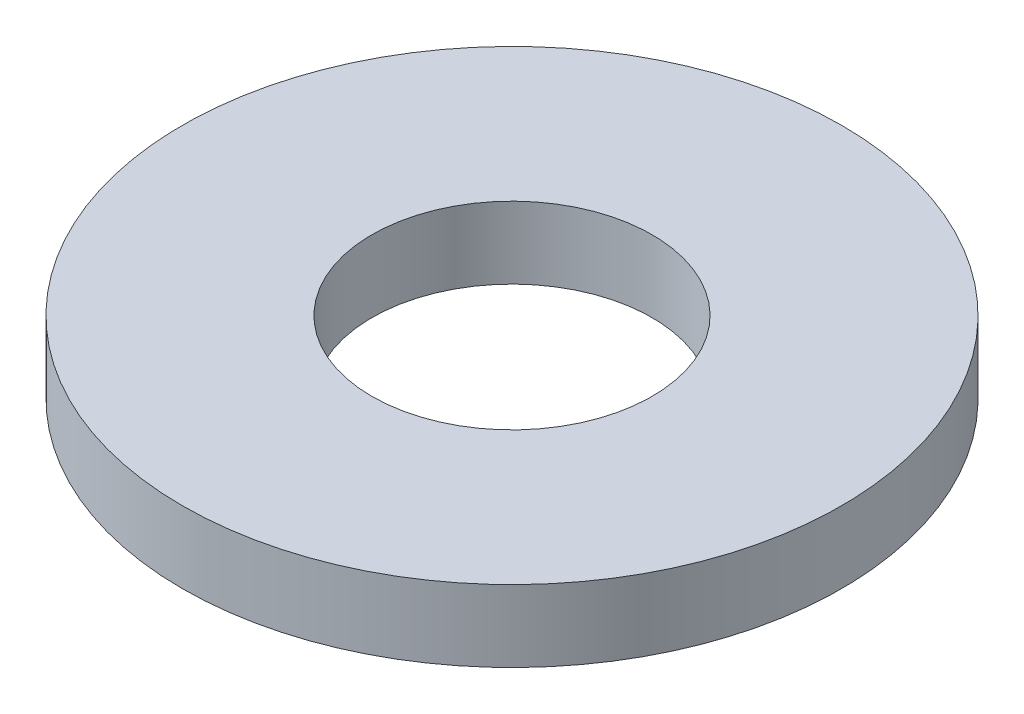
ISO-10303-21;
HEADER;
FILE_DESCRIPTION(('STEP AP214'),'2;1');
FILE_NAME('part.step','',(''),(''),'','','');
FILE_SCHEMA(('AUTOMOTIVE_DESIGN { 1 0 10303 214 1 1 1 1 }'));
ENDSEC;
DATA;
#1=APPLICATION_CONTEXT('core data for automotive mechanical design processes');
#2=APPLICATION_PROTOCOL_DEFINITION('international standard','automotive_design',2000,#1);
#3=PRODUCT_CONTEXT('',#1,'mechanical');
#4=PRODUCT('Part','Part','',(#3));
#5=PRODUCT_RELATED_PRODUCT_CATEGORY('part','',(#4));
#6=PRODUCT_DEFINITION_FORMATION('','',#4);
#7=PRODUCT_DEFINITION_CONTEXT('part definition',#1,'design');
#8=PRODUCT_DEFINITION('design','',#6,#7);
#9=PRODUCT_DEFINITION_SHAPE('','',#8);
#10=(LENGTH_UNIT() NAMED_UNIT(*) SI_UNIT(.MILLI.,.METRE.));
#11=(NAMED_UNIT(*) PLANE_ANGLE_UNIT() SI_UNIT($,.RADIAN.));
#12=(NAMED_UNIT(*) SI_UNIT($,.STERADIAN.) SOLID_ANGLE_UNIT());
#13=UNCERTAINTY_MEASURE_WITH_UNIT(LENGTH_MEASURE(1.E-05),#10,'distance_accuracy_value','');
#14=(GEOMETRIC_REPRESENTATION_CONTEXT(3) GLOBAL_UNCERTAINTY_ASSIGNED_CONTEXT((#13)) GLOBAL_UNIT_ASSIGNED_CONTEXT((#10,
#11,#12)) REPRESENTATION_CONTEXT('',''));
#15=CARTESIAN_POINT('',(0.,0.,0.));
#16=DIRECTION('',(0.,0.,1.));
#17=DIRECTION('',(1.,0.,0.));
#18=AXIS2_PLACEMENT_3D('',#15,#16,#17);
#19=CARTESIAN_POINT('',(0.,2.032,0.));
#20=DIRECTION('',(0.,-1.,0.));
#21=DIRECTION('',(0.,0.,-1.));
#22=AXIS2_PLACEMENT_3D('',#19,#20,#21);
#23=CYLINDRICAL_SURFACE('',#22,9.3218);
#24=CARTESIAN_POINT('',(0.,2.032,0.));
#25=DIRECTION('',(0.,1.,0.));
#26=DIRECTION('',(0.,0.,1.));
#27=AXIS2_PLACEMENT_3D('',#24,#25,#26);
#28=CIRCLE('',#27,9.3218);
#29=CARTESIAN_POINT('',(0.,2.032,9.3218));
#30=VERTEX_POINT('',#29);
#31=EDGE_CURVE('E12',#30,#30,#28,.T.);
#32=ORIENTED_EDGE('',*,*,#31,.F.);
#33=EDGE_LOOP('',(#32));
#34=FACE_BOUND('',#33,.T.);
#35=CARTESIAN_POINT('',(0.,0.,0.));
#36=DIRECTION('',(0.,1.,0.));
#37=DIRECTION('',(0.,0.,1.));
#38=AXIS2_PLACEMENT_3D('',#35,#36,#37);
#39=CIRCLE('',#38,9.3218);
#40=CARTESIAN_POINT('',(0.,0.,9.3218));
#41=VERTEX_POINT('',#40);
#42=EDGE_CURVE('E45',#41,#41,#39,.T.);
#43=ORIENTED_EDGE('',*,*,#42,.T.);
#44=EDGE_LOOP('',(#43));
#45=FACE_BOUND('',#44,.T.);
#46=ADVANCED_FACE('F42',(#34,#45),#23,.T.);
#47=CARTESIAN_POINT('',(0.,2.032,0.));
#48=DIRECTION('',(0.,1.,0.));
#49=DIRECTION('',(0.,0.,1.));
#50=AXIS2_PLACEMENT_3D('',#47,#48,#49);
#51=PLANE('',#50);
#52=CARTESIAN_POINT('',(0.,2.032,0.));
#53=DIRECTION('',(0.,1.,0.));
#54=DIRECTION('',(0.,0.,1.));
#55=AXIS2_PLACEMENT_3D('',#52,#53,#54);
#56=CIRCLE('',#55,3.9624);
#57=CARTESIAN_POINT('',(0.,2.032,3.9624));
#58=VERTEX_POINT('',#57);
#59=EDGE_CURVE('E54',#58,#58,#56,.T.);
#60=ORIENTED_EDGE('',*,*,#59,.F.);
#61=EDGE_LOOP('',(#60));
#62=FACE_BOUND('',#61,.T.);
#63=ORIENTED_EDGE('',*,*,#31,.T.);
#64=EDGE_LOOP('',(#63));
#65=FACE_BOUND('',#64,.T.);
#66=ADVANCED_FACE('F69',(#62,#65),#51,.T.);
#67=CARTESIAN_POINT('',(0.,0.,0.));
#68=DIRECTION('',(0.,1.,0.));
#69=DIRECTION('',(0.,0.,1.));
#70=AXIS2_PLACEMENT_3D('',#67,#68,#69);
#71=PLANE('',#70);
#72=CARTESIAN_POINT('',(0.,0.,0.));
#73=DIRECTION('',(0.,1.,0.));
#74=DIRECTION('',(0.,0.,1.));
#75=AXIS2_PLACEMENT_3D('',#72,#73,#74);
#76=CIRCLE('',#75,3.9624);
#77=CARTESIAN_POINT('',(0.,0.,3.9624));
#78=VERTEX_POINT('',#77);
#79=EDGE_CURVE('E52',#78,#78,#76,.T.);
#80=ORIENTED_EDGE('',*,*,#79,.T.);
#81=EDGE_LOOP('',(#80));
#82=FACE_BOUND('',#81,.T.);
#83=ORIENTED_EDGE('',*,*,#42,.F.);
#84=EDGE_LOOP('',(#83));
#85=FACE_BOUND('',#84,.T.);
#86=ADVANCED_FACE('F60',(#82,#85),#71,.F.);
#87=CARTESIAN_POINT('',(0.,0.,0.));
#88=DIRECTION('',(0.,1.,0.));
#89=DIRECTION('',(0.,0.,1.));
#90=AXIS2_PLACEMENT_3D('',#87,#88,#89);
#91=CYLINDRICAL_SURFACE('',#90,3.9624);
#92=ORIENTED_EDGE('',*,*,#79,.F.);
#93=EDGE_LOOP('',(#92));
#94=FACE_BOUND('',#93,.T.);
#95=ORIENTED_EDGE('',*,*,#59,.T.);
#96=EDGE_LOOP('',(#95));
#97=FACE_BOUND('',#96,.T.);
#98=ADVANCED_FACE('F63',(#94,#97),#91,.F.);
#99=CLOSED_SHELL('',(#46,#66,#86,#98));
#100=MANIFOLD_SOLID_BREP('B2',#99);
#101=ADVANCED_BREP_SHAPE_REPRESENTATION('',(#18,#100),#14);
#102=SHAPE_DEFINITION_REPRESENTATION(#9,#101);
ENDSEC;
END-ISO-10303-21;
